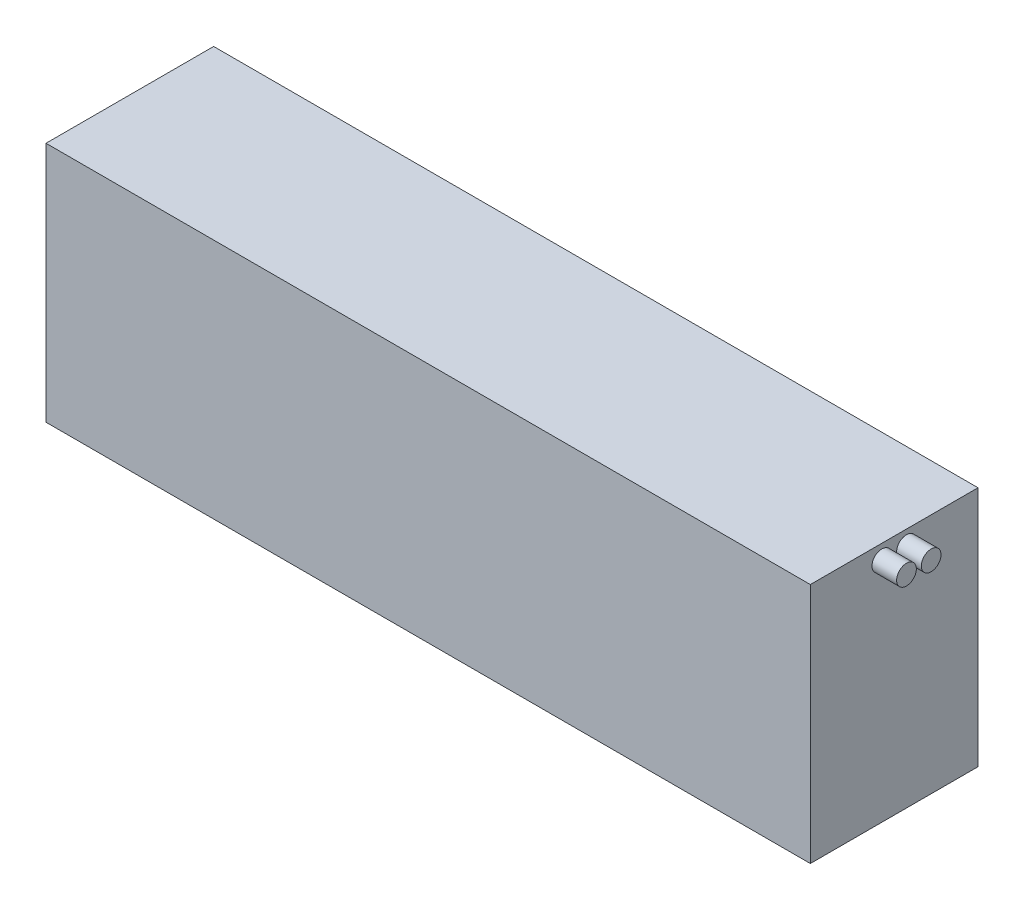
ISO-10303-21;
HEADER;
FILE_DESCRIPTION(('STEP AP214'),'2;1');
FILE_NAME('part.step','',(''),(''),'','','');
FILE_SCHEMA(('AUTOMOTIVE_DESIGN { 1 0 10303 214 1 1 1 1 }'));
ENDSEC;
DATA;
#1=APPLICATION_CONTEXT('core data for automotive mechanical design processes');
#2=APPLICATION_PROTOCOL_DEFINITION('international standard','automotive_design',2000,#1);
#3=PRODUCT_CONTEXT('',#1,'mechanical');
#4=PRODUCT('Part','Part','',(#3));
#5=PRODUCT_RELATED_PRODUCT_CATEGORY('part','',(#4));
#6=PRODUCT_DEFINITION_FORMATION('','',#4);
#7=PRODUCT_DEFINITION_CONTEXT('part definition',#1,'design');
#8=PRODUCT_DEFINITION('design','',#6,#7);
#9=PRODUCT_DEFINITION_SHAPE('','',#8);
#10=(LENGTH_UNIT() NAMED_UNIT(*) SI_UNIT(.MILLI.,.METRE.));
#11=(NAMED_UNIT(*) PLANE_ANGLE_UNIT() SI_UNIT($,.RADIAN.));
#12=(NAMED_UNIT(*) SI_UNIT($,.STERADIAN.) SOLID_ANGLE_UNIT());
#13=UNCERTAINTY_MEASURE_WITH_UNIT(LENGTH_MEASURE(1.E-05),#10,'distance_accuracy_value','');
#14=(GEOMETRIC_REPRESENTATION_CONTEXT(3) GLOBAL_UNCERTAINTY_ASSIGNED_CONTEXT((#13)) GLOBAL_UNIT_ASSIGNED_CONTEXT((#10,
#11,#12)) REPRESENTATION_CONTEXT('',''));
#15=CARTESIAN_POINT('',(0.,0.,0.));
#16=DIRECTION('',(0.,0.,1.));
#17=DIRECTION('',(1.,0.,0.));
#18=AXIS2_PLACEMENT_3D('',#15,#16,#17);
#19=CARTESIAN_POINT('',(155.,49.,0.));
#20=DIRECTION('',(-1.,0.,0.));
#21=DIRECTION('',(0.,0.,1.));
#22=AXIS2_PLACEMENT_3D('',#19,#20,#21);
#23=PLANE('',#22);
#24=CARTESIAN_POINT('',(155.,46.,-14.5));
#25=DIRECTION('',(-1.,0.,0.));
#26=DIRECTION('',(0.,0.,1.));
#27=AXIS2_PLACEMENT_3D('',#24,#25,#26);
#28=CIRCLE('',#27,2.);
#29=CARTESIAN_POINT('',(155.,46.,-12.5));
#30=VERTEX_POINT('',#29);
#31=EDGE_CURVE('E41',#30,#30,#28,.F.);
#32=ORIENTED_EDGE('',*,*,#31,.F.);
#33=EDGE_LOOP('',(#32));
#34=FACE_BOUND('',#33,.T.);
#35=DIRECTION('',(0.,0.,-1.));
#36=VECTOR('',#35,1.);
#37=CARTESIAN_POINT('',(155.,0.,0.));
#38=LINE('',#37,#36);
#39=CARTESIAN_POINT('',(155.,0.,0.));
#40=VERTEX_POINT('',#39);
#41=CARTESIAN_POINT('',(155.,0.,-34.));
#42=VERTEX_POINT('',#41);
#43=EDGE_CURVE('E66',#40,#42,#38,.T.);
#44=ORIENTED_EDGE('',*,*,#43,.T.);
#45=DIRECTION('',(0.,-1.,0.));
#46=VECTOR('',#45,1.);
#47=CARTESIAN_POINT('',(155.,49.,-34.));
#48=LINE('',#47,#46);
#49=CARTESIAN_POINT('',(155.,49.,-34.));
#50=VERTEX_POINT('',#49);
#51=EDGE_CURVE('E92',#50,#42,#48,.T.);
#52=ORIENTED_EDGE('',*,*,#51,.F.);
#53=DIRECTION('',(0.,0.,-1.));
#54=VECTOR('',#53,1.);
#55=CARTESIAN_POINT('',(155.,49.,0.));
#56=LINE('',#55,#54);
#57=CARTESIAN_POINT('',(155.,49.,0.));
#58=VERTEX_POINT('',#57);
#59=EDGE_CURVE('E83',#58,#50,#56,.T.);
#60=ORIENTED_EDGE('',*,*,#59,.F.);
#61=DIRECTION('',(0.,-1.,0.));
#62=VECTOR('',#61,1.);
#63=CARTESIAN_POINT('',(155.,49.,0.));
#64=LINE('',#63,#62);
#65=EDGE_CURVE('E88',#58,#40,#64,.T.);
#66=ORIENTED_EDGE('',*,*,#65,.T.);
#67=EDGE_LOOP('',(#44,#52,#60,#66));
#68=FACE_BOUND('',#67,.T.);
#69=CARTESIAN_POINT('',(155.,46.,-19.5));
#70=DIRECTION('',(-1.,0.,0.));
#71=DIRECTION('',(0.,0.,1.));
#72=AXIS2_PLACEMENT_3D('',#69,#70,#71);
#73=CIRCLE('',#72,2.);
#74=CARTESIAN_POINT('',(155.,46.,-17.5));
#75=VERTEX_POINT('',#74);
#76=EDGE_CURVE('E11',#75,#75,#73,.F.);
#77=ORIENTED_EDGE('',*,*,#76,.F.);
#78=EDGE_LOOP('',(#77));
#79=FACE_BOUND('',#78,.T.);
#80=ADVANCED_FACE('F32',(#34,#68,#79),#23,.F.);
#81=CARTESIAN_POINT('',(0.,49.,0.));
#82=DIRECTION('',(1.,0.,0.));
#83=DIRECTION('',(0.,0.,-1.));
#84=AXIS2_PLACEMENT_3D('',#81,#82,#83);
#85=PLANE('',#84);
#86=DIRECTION('',(0.,0.,1.));
#87=VECTOR('',#86,1.);
#88=CARTESIAN_POINT('',(0.,0.,0.));
#89=LINE('',#88,#87);
#90=CARTESIAN_POINT('',(0.,0.,-34.));
#91=VERTEX_POINT('',#90);
#92=CARTESIAN_POINT('',(0.,0.,0.));
#93=VERTEX_POINT('',#92);
#94=EDGE_CURVE('E100',#91,#93,#89,.T.);
#95=ORIENTED_EDGE('',*,*,#94,.T.);
#96=DIRECTION('',(0.,-1.,0.));
#97=VECTOR('',#96,1.);
#98=CARTESIAN_POINT('',(0.,49.,0.));
#99=LINE('',#98,#97);
#100=CARTESIAN_POINT('',(0.,49.,0.));
#101=VERTEX_POINT('',#100);
#102=EDGE_CURVE('E91',#101,#93,#99,.T.);
#103=ORIENTED_EDGE('',*,*,#102,.F.);
#104=DIRECTION('',(0.,0.,1.));
#105=VECTOR('',#104,1.);
#106=CARTESIAN_POINT('',(0.,49.,0.));
#107=LINE('',#106,#105);
#108=CARTESIAN_POINT('',(0.,49.,-34.));
#109=VERTEX_POINT('',#108);
#110=EDGE_CURVE('E85',#109,#101,#107,.T.);
#111=ORIENTED_EDGE('',*,*,#110,.F.);
#112=DIRECTION('',(0.,-1.,0.));
#113=VECTOR('',#112,1.);
#114=CARTESIAN_POINT('',(0.,49.,-34.));
#115=LINE('',#114,#113);
#116=EDGE_CURVE('E96',#109,#91,#115,.T.);
#117=ORIENTED_EDGE('',*,*,#116,.T.);
#118=EDGE_LOOP('',(#95,#103,#111,#117));
#119=FACE_BOUND('',#118,.T.);
#120=ADVANCED_FACE('F34',(#119),#85,.F.);
#121=CARTESIAN_POINT('',(0.,49.,0.));
#122=DIRECTION('',(0.,0.,-1.));
#123=DIRECTION('',(-1.,0.,0.));
#124=AXIS2_PLACEMENT_3D('',#121,#122,#123);
#125=PLANE('',#124);
#126=DIRECTION('',(1.,0.,0.));
#127=VECTOR('',#126,1.);
#128=CARTESIAN_POINT('',(0.,0.,0.));
#129=LINE('',#128,#127);
#130=EDGE_CURVE('E90',#93,#40,#129,.T.);
#131=ORIENTED_EDGE('',*,*,#130,.T.);
#132=ORIENTED_EDGE('',*,*,#65,.F.);
#133=DIRECTION('',(1.,0.,0.));
#134=VECTOR('',#133,1.);
#135=CARTESIAN_POINT('',(0.,49.,0.));
#136=LINE('',#135,#134);
#137=EDGE_CURVE('E80',#101,#58,#136,.T.);
#138=ORIENTED_EDGE('',*,*,#137,.F.);
#139=ORIENTED_EDGE('',*,*,#102,.T.);
#140=EDGE_LOOP('',(#131,#132,#138,#139));
#141=FACE_BOUND('',#140,.T.);
#142=ADVANCED_FACE('F89',(#141),#125,.F.);
#143=CARTESIAN_POINT('',(0.,49.,-34.));
#144=DIRECTION('',(0.,0.,1.));
#145=DIRECTION('',(1.,0.,0.));
#146=AXIS2_PLACEMENT_3D('',#143,#144,#145);
#147=PLANE('',#146);
#148=DIRECTION('',(-1.,0.,0.));
#149=VECTOR('',#148,1.);
#150=CARTESIAN_POINT('',(0.,0.,-34.));
#151=LINE('',#150,#149);
#152=EDGE_CURVE('E72',#42,#91,#151,.T.);
#153=ORIENTED_EDGE('',*,*,#152,.T.);
#154=ORIENTED_EDGE('',*,*,#116,.F.);
#155=DIRECTION('',(-1.,0.,0.));
#156=VECTOR('',#155,1.);
#157=CARTESIAN_POINT('',(0.,49.,-34.));
#158=LINE('',#157,#156);
#159=EDGE_CURVE('E49',#50,#109,#158,.T.);
#160=ORIENTED_EDGE('',*,*,#159,.F.);
#161=ORIENTED_EDGE('',*,*,#51,.T.);
#162=EDGE_LOOP('',(#153,#154,#160,#161));
#163=FACE_BOUND('',#162,.T.);
#164=ADVANCED_FACE('F121',(#163),#147,.F.);
#165=CARTESIAN_POINT('',(0.,49.,0.));
#166=DIRECTION('',(0.,-1.,0.));
#167=DIRECTION('',(0.,0.,-1.));
#168=AXIS2_PLACEMENT_3D('',#165,#166,#167);
#169=PLANE('',#168);
#170=ORIENTED_EDGE('',*,*,#110,.T.);
#171=ORIENTED_EDGE('',*,*,#137,.T.);
#172=ORIENTED_EDGE('',*,*,#59,.T.);
#173=ORIENTED_EDGE('',*,*,#159,.T.);
#174=EDGE_LOOP('',(#170,#171,#172,#173));
#175=FACE_BOUND('',#174,.T.);
#176=ADVANCED_FACE('F81',(#175),#169,.F.);
#177=CARTESIAN_POINT('',(0.,0.,0.));
#178=DIRECTION('',(0.,-1.,0.));
#179=DIRECTION('',(0.,0.,-1.));
#180=AXIS2_PLACEMENT_3D('',#177,#178,#179);
#181=PLANE('',#180);
#182=ORIENTED_EDGE('',*,*,#94,.F.);
#183=ORIENTED_EDGE('',*,*,#152,.F.);
#184=ORIENTED_EDGE('',*,*,#43,.F.);
#185=ORIENTED_EDGE('',*,*,#130,.F.);
#186=EDGE_LOOP('',(#182,#183,#184,#185));
#187=FACE_BOUND('',#186,.T.);
#188=ADVANCED_FACE('F130',(#187),#181,.T.);
#189=CARTESIAN_POINT('',(160.,46.,-14.5));
#190=DIRECTION('',(-1.,0.,0.));
#191=DIRECTION('',(0.,0.,1.));
#192=AXIS2_PLACEMENT_3D('',#189,#190,#191);
#193=CYLINDRICAL_SURFACE('',#192,2.);
#194=CARTESIAN_POINT('',(160.,46.,-14.5));
#195=DIRECTION('',(1.,0.,0.));
#196=DIRECTION('',(0.,0.,-1.));
#197=AXIS2_PLACEMENT_3D('',#194,#195,#196);
#198=CIRCLE('',#197,2.);
#199=CARTESIAN_POINT('',(160.,46.,-16.5));
#200=VERTEX_POINT('',#199);
#201=EDGE_CURVE('E103',#200,#200,#198,.T.);
#202=ORIENTED_EDGE('',*,*,#201,.F.);
#203=EDGE_LOOP('',(#202));
#204=FACE_BOUND('',#203,.T.);
#205=ORIENTED_EDGE('',*,*,#31,.T.);
#206=EDGE_LOOP('',(#205));
#207=FACE_BOUND('',#206,.T.);
#208=ADVANCED_FACE('F112',(#204,#207),#193,.T.);
#209=CARTESIAN_POINT('',(160.,46.,-14.5));
#210=DIRECTION('',(1.,0.,0.));
#211=DIRECTION('',(0.,0.,-1.));
#212=AXIS2_PLACEMENT_3D('',#209,#210,#211);
#213=PLANE('',#212);
#214=ORIENTED_EDGE('',*,*,#201,.T.);
#215=EDGE_LOOP('',(#214));
#216=FACE_BOUND('',#215,.T.);
#217=ADVANCED_FACE('F139',(#216),#213,.T.);
#218=CARTESIAN_POINT('',(160.,46.,-19.5));
#219=DIRECTION('',(-1.,0.,0.));
#220=DIRECTION('',(0.,0.,1.));
#221=AXIS2_PLACEMENT_3D('',#218,#219,#220);
#222=CYLINDRICAL_SURFACE('',#221,2.);
#223=CARTESIAN_POINT('',(160.,46.,-19.5));
#224=DIRECTION('',(1.,0.,0.));
#225=DIRECTION('',(0.,0.,1.));
#226=AXIS2_PLACEMENT_3D('',#223,#224,#225);
#227=CIRCLE('',#226,2.);
#228=CARTESIAN_POINT('',(160.,46.,-17.5));
#229=VERTEX_POINT('',#228);
#230=EDGE_CURVE('E155',#229,#229,#227,.T.);
#231=ORIENTED_EDGE('',*,*,#230,.F.);
#232=EDGE_LOOP('',(#231));
#233=FACE_BOUND('',#232,.T.);
#234=ORIENTED_EDGE('',*,*,#76,.T.);
#235=EDGE_LOOP('',(#234));
#236=FACE_BOUND('',#235,.T.);
#237=ADVANCED_FACE('F143',(#233,#236),#222,.T.);
#238=CARTESIAN_POINT('',(160.,46.,-19.5));
#239=DIRECTION('',(-1.,0.,0.));
#240=DIRECTION('',(0.,0.,1.));
#241=AXIS2_PLACEMENT_3D('',#238,#239,#240);
#242=PLANE('',#241);
#243=ORIENTED_EDGE('',*,*,#230,.T.);
#244=EDGE_LOOP('',(#243));
#245=FACE_BOUND('',#244,.T.);
#246=ADVANCED_FACE('F147',(#245),#242,.F.);
#247=CLOSED_SHELL('',(#80,#120,#142,#164,#176,#188,#208,#217,#237,#246));
#248=MANIFOLD_SOLID_BREP('B2',#247);
#249=ADVANCED_BREP_SHAPE_REPRESENTATION('',(#18,#248),#14);
#250=SHAPE_DEFINITION_REPRESENTATION(#9,#249);
ENDSEC;
END-ISO-10303-21;
